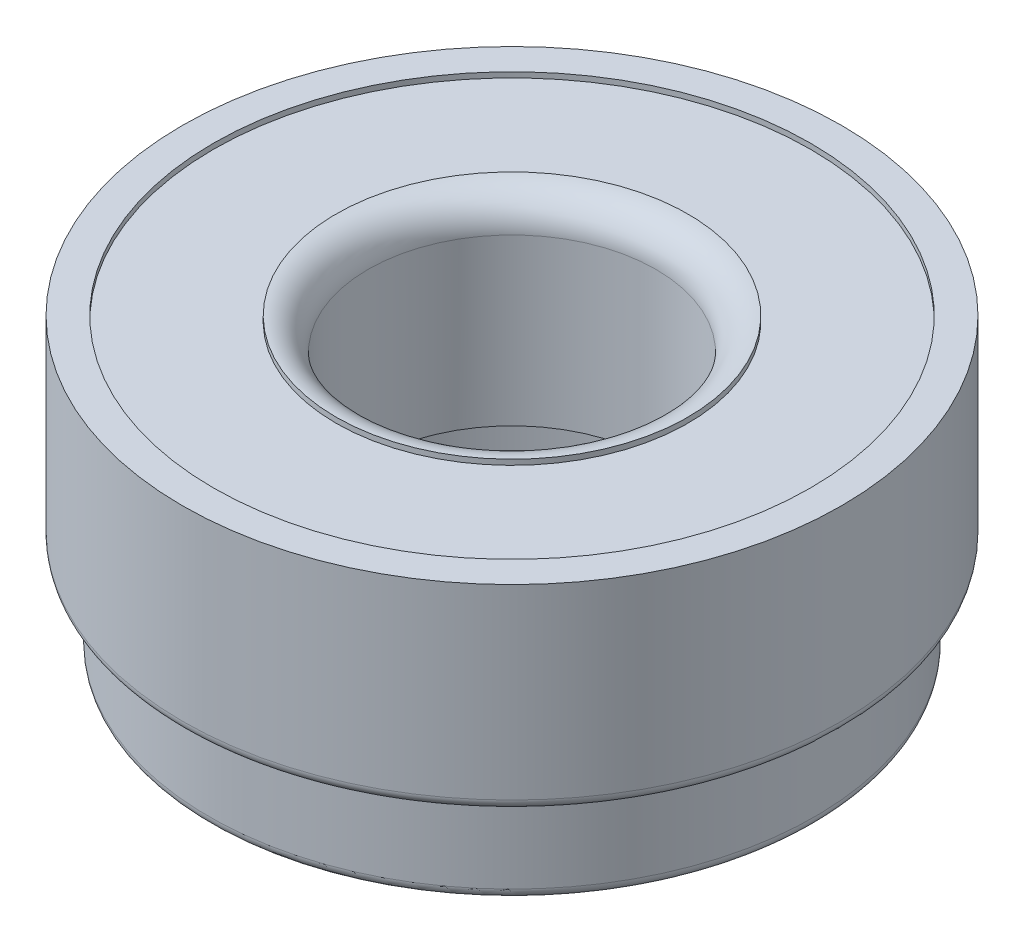
ISO-10303-21;
HEADER;
FILE_DESCRIPTION(('STEP AP214'),'2;1');
FILE_NAME('part.step','',(''),(''),'','','');
FILE_SCHEMA(('AUTOMOTIVE_DESIGN { 1 0 10303 214 1 1 1 1 }'));
ENDSEC;
DATA;
#1=APPLICATION_CONTEXT('core data for automotive mechanical design processes');
#2=APPLICATION_PROTOCOL_DEFINITION('international standard','automotive_design',2000,#1);
#3=PRODUCT_CONTEXT('',#1,'mechanical');
#4=PRODUCT('Part','Part','',(#3));
#5=PRODUCT_RELATED_PRODUCT_CATEGORY('part','',(#4));
#6=PRODUCT_DEFINITION_FORMATION('','',#4);
#7=PRODUCT_DEFINITION_CONTEXT('part definition',#1,'design');
#8=PRODUCT_DEFINITION('design','',#6,#7);
#9=PRODUCT_DEFINITION_SHAPE('','',#8);
#10=(LENGTH_UNIT() NAMED_UNIT(*) SI_UNIT(.MILLI.,.METRE.));
#11=(NAMED_UNIT(*) PLANE_ANGLE_UNIT() SI_UNIT($,.RADIAN.));
#12=(NAMED_UNIT(*) SI_UNIT($,.STERADIAN.) SOLID_ANGLE_UNIT());
#13=UNCERTAINTY_MEASURE_WITH_UNIT(LENGTH_MEASURE(1.E-05),#10,'distance_accuracy_value','');
#14=(GEOMETRIC_REPRESENTATION_CONTEXT(3) GLOBAL_UNCERTAINTY_ASSIGNED_CONTEXT((#13)) GLOBAL_UNIT_ASSIGNED_CONTEXT((#10,
#11,#12)) REPRESENTATION_CONTEXT('',''));
#15=CARTESIAN_POINT('',(0.,0.,0.));
#16=DIRECTION('',(0.,0.,1.));
#17=DIRECTION('',(1.,0.,0.));
#18=AXIS2_PLACEMENT_3D('',#15,#16,#17);
#19=CARTESIAN_POINT('',(0.,0.,0.));
#20=DIRECTION('',(0.,-1.,0.));
#21=DIRECTION('',(0.,0.,-1.));
#22=AXIS2_PLACEMENT_3D('',#19,#20,#21);
#23=CYLINDRICAL_SURFACE('',#22,28.4);
#24=CARTESIAN_POINT('',(0.,1.,0.));
#25=DIRECTION('',(0.,-1.,0.));
#26=DIRECTION('',(0.,0.,-1.));
#27=AXIS2_PLACEMENT_3D('',#24,#25,#26);
#28=CIRCLE('',#27,28.4);
#29=CARTESIAN_POINT('',(0.,1.,-28.4));
#30=VERTEX_POINT('',#29);
#31=EDGE_CURVE('E48',#30,#30,#28,.F.);
#32=ORIENTED_EDGE('',*,*,#31,.T.);
#33=EDGE_LOOP('',(#32));
#34=FACE_BOUND('',#33,.T.);
#35=CARTESIAN_POINT('',(0.,9.,0.));
#36=DIRECTION('',(0.,-1.,0.));
#37=DIRECTION('',(0.,0.,-1.));
#38=AXIS2_PLACEMENT_3D('',#35,#36,#37);
#39=CIRCLE('',#38,28.4);
#40=CARTESIAN_POINT('',(0.,9.,-28.4));
#41=VERTEX_POINT('',#40);
#42=EDGE_CURVE('E68',#41,#41,#39,.T.);
#43=ORIENTED_EDGE('',*,*,#42,.T.);
#44=EDGE_LOOP('',(#43));
#45=FACE_BOUND('',#44,.T.);
#46=ADVANCED_FACE('F33',(#34,#45),#23,.T.);
#47=CARTESIAN_POINT('',(23.4,0.,0.));
#48=DIRECTION('',(0.,-1.,0.));
#49=DIRECTION('',(0.,0.,-1.));
#50=AXIS2_PLACEMENT_3D('',#47,#48,#49);
#51=PLANE('',#50);
#52=CARTESIAN_POINT('',(0.,0.,0.));
#53=DIRECTION('',(0.,-1.,0.));
#54=DIRECTION('',(0.,0.,-1.));
#55=AXIS2_PLACEMENT_3D('',#52,#53,#54);
#56=CIRCLE('',#55,27.4);
#57=CARTESIAN_POINT('',(0.,0.,-27.4));
#58=VERTEX_POINT('',#57);
#59=EDGE_CURVE('E53',#58,#58,#56,.T.);
#60=ORIENTED_EDGE('',*,*,#59,.T.);
#61=EDGE_LOOP('',(#60));
#62=FACE_BOUND('',#61,.T.);
#63=CARTESIAN_POINT('',(0.,0.,0.));
#64=DIRECTION('',(0.,-1.,0.));
#65=DIRECTION('',(0.,0.,-1.));
#66=AXIS2_PLACEMENT_3D('',#63,#64,#65);
#67=CIRCLE('',#66,23.4);
#68=CARTESIAN_POINT('',(0.,0.,-23.4));
#69=VERTEX_POINT('',#68);
#70=EDGE_CURVE('E56',#69,#69,#67,.T.);
#71=ORIENTED_EDGE('',*,*,#70,.F.);
#72=EDGE_LOOP('',(#71));
#73=FACE_BOUND('',#72,.T.);
#74=ADVANCED_FACE('F118',(#62,#73),#51,.T.);
#75=CARTESIAN_POINT('',(0.,0.,0.));
#76=DIRECTION('',(0.,-1.,0.));
#77=DIRECTION('',(0.,0.,-1.));
#78=AXIS2_PLACEMENT_3D('',#75,#76,#77);
#79=CYLINDRICAL_SURFACE('',#78,23.4);
#80=ORIENTED_EDGE('',*,*,#70,.T.);
#81=EDGE_LOOP('',(#80));
#82=FACE_BOUND('',#81,.T.);
#83=CARTESIAN_POINT('',(0.,9.,0.));
#84=DIRECTION('',(0.,-1.,0.));
#85=DIRECTION('',(0.,0.,-1.));
#86=AXIS2_PLACEMENT_3D('',#83,#84,#85);
#87=CIRCLE('',#86,23.4);
#88=CARTESIAN_POINT('',(0.,9.,-23.4));
#89=VERTEX_POINT('',#88);
#90=EDGE_CURVE('E59',#89,#89,#87,.T.);
#91=ORIENTED_EDGE('',*,*,#90,.F.);
#92=EDGE_LOOP('',(#91));
#93=FACE_BOUND('',#92,.T.);
#94=ADVANCED_FACE('F124',(#82,#93),#79,.F.);
#95=CARTESIAN_POINT('',(13.5,9.,0.));
#96=DIRECTION('',(0.,-1.,0.));
#97=DIRECTION('',(0.,0.,-1.));
#98=AXIS2_PLACEMENT_3D('',#95,#96,#97);
#99=PLANE('',#98);
#100=ORIENTED_EDGE('',*,*,#90,.T.);
#101=EDGE_LOOP('',(#100));
#102=FACE_BOUND('',#101,.T.);
#103=CARTESIAN_POINT('',(0.,9.,0.));
#104=DIRECTION('',(0.,-1.,0.));
#105=DIRECTION('',(0.,0.,-1.));
#106=AXIS2_PLACEMENT_3D('',#103,#104,#105);
#107=CIRCLE('',#106,13.5);
#108=CARTESIAN_POINT('',(0.,9.,-13.5));
#109=VERTEX_POINT('',#108);
#110=EDGE_CURVE('E62',#109,#109,#107,.T.);
#111=ORIENTED_EDGE('',*,*,#110,.F.);
#112=EDGE_LOOP('',(#111));
#113=FACE_BOUND('',#112,.T.);
#114=ADVANCED_FACE('F171',(#102,#113),#99,.T.);
#115=CARTESIAN_POINT('',(0.,0.,0.));
#116=DIRECTION('',(0.,-1.,0.));
#117=DIRECTION('',(0.,0.,-1.));
#118=AXIS2_PLACEMENT_3D('',#115,#116,#117);
#119=CYLINDRICAL_SURFACE('',#118,13.5);
#120=CARTESIAN_POINT('',(0.,24.5,0.));
#121=DIRECTION('',(0.,1.,0.));
#122=DIRECTION('',(0.,0.,1.));
#123=AXIS2_PLACEMENT_3D('',#120,#121,#122);
#124=CIRCLE('',#123,13.5);
#125=CARTESIAN_POINT('',(0.,24.5,13.5));
#126=VERTEX_POINT('',#125);
#127=EDGE_CURVE('E10',#126,#126,#124,.T.);
#128=ORIENTED_EDGE('',*,*,#127,.T.);
#129=EDGE_LOOP('',(#128));
#130=FACE_BOUND('',#129,.T.);
#131=ORIENTED_EDGE('',*,*,#110,.T.);
#132=EDGE_LOOP('',(#131));
#133=FACE_BOUND('',#132,.T.);
#134=ADVANCED_FACE('F104',(#130,#133),#119,.F.);
#135=CARTESIAN_POINT('',(30.9,27.5,0.));
#136=DIRECTION('',(0.,1.,0.));
#137=DIRECTION('',(0.,0.,1.));
#138=AXIS2_PLACEMENT_3D('',#135,#136,#137);
#139=PLANE('',#138);
#140=CARTESIAN_POINT('',(0.,27.5,0.));
#141=DIRECTION('',(0.,1.,0.));
#142=DIRECTION('',(0.,0.,1.));
#143=AXIS2_PLACEMENT_3D('',#140,#141,#142);
#144=CIRCLE('',#143,28.);
#145=CARTESIAN_POINT('',(0.,27.5,28.));
#146=VERTEX_POINT('',#145);
#147=EDGE_CURVE('E72',#146,#146,#144,.T.);
#148=ORIENTED_EDGE('',*,*,#147,.F.);
#149=EDGE_LOOP('',(#148));
#150=FACE_BOUND('',#149,.T.);
#151=CARTESIAN_POINT('',(0.,27.5,0.));
#152=DIRECTION('',(0.,-1.,0.));
#153=DIRECTION('',(0.,0.,-1.));
#154=AXIS2_PLACEMENT_3D('',#151,#152,#153);
#155=CIRCLE('',#154,30.9);
#156=CARTESIAN_POINT('',(0.,27.5,-30.9));
#157=VERTEX_POINT('',#156);
#158=EDGE_CURVE('E65',#157,#157,#155,.T.);
#159=ORIENTED_EDGE('',*,*,#158,.F.);
#160=EDGE_LOOP('',(#159));
#161=FACE_BOUND('',#160,.T.);
#162=ADVANCED_FACE('F100',(#150,#161),#139,.T.);
#163=CARTESIAN_POINT('',(0.,0.,0.));
#164=DIRECTION('',(0.,-1.,0.));
#165=DIRECTION('',(0.,0.,-1.));
#166=AXIS2_PLACEMENT_3D('',#163,#164,#165);
#167=CYLINDRICAL_SURFACE('',#166,30.9);
#168=CARTESIAN_POINT('',(0.,10.,0.));
#169=DIRECTION('',(0.,-1.,0.));
#170=DIRECTION('',(0.,0.,-1.));
#171=AXIS2_PLACEMENT_3D('',#168,#169,#170);
#172=CIRCLE('',#171,30.9);
#173=CARTESIAN_POINT('',(0.,10.,-30.9));
#174=VERTEX_POINT('',#173);
#175=EDGE_CURVE('E40',#174,#174,#172,.F.);
#176=ORIENTED_EDGE('',*,*,#175,.T.);
#177=EDGE_LOOP('',(#176));
#178=FACE_BOUND('',#177,.T.);
#179=ORIENTED_EDGE('',*,*,#158,.T.);
#180=EDGE_LOOP('',(#179));
#181=FACE_BOUND('',#180,.T.);
#182=ADVANCED_FACE('F103',(#178,#181),#167,.T.);
#183=CARTESIAN_POINT('',(28.4,9.,0.));
#184=DIRECTION('',(0.,-1.,0.));
#185=DIRECTION('',(0.,0.,-1.));
#186=AXIS2_PLACEMENT_3D('',#183,#184,#185);
#187=PLANE('',#186);
#188=CARTESIAN_POINT('',(0.,9.,0.));
#189=DIRECTION('',(0.,-1.,0.));
#190=DIRECTION('',(0.,0.,-1.));
#191=AXIS2_PLACEMENT_3D('',#188,#189,#190);
#192=CIRCLE('',#191,29.9);
#193=CARTESIAN_POINT('',(0.,9.,-29.9));
#194=VERTEX_POINT('',#193);
#195=EDGE_CURVE('E44',#194,#194,#192,.T.);
#196=ORIENTED_EDGE('',*,*,#195,.T.);
#197=EDGE_LOOP('',(#196));
#198=FACE_BOUND('',#197,.T.);
#199=ORIENTED_EDGE('',*,*,#42,.F.);
#200=EDGE_LOOP('',(#199));
#201=FACE_BOUND('',#200,.T.);
#202=ADVANCED_FACE('F109',(#198,#201),#187,.T.);
#203=CARTESIAN_POINT('',(0.,1.,0.));
#204=DIRECTION('',(0.,-1.,0.));
#205=DIRECTION('',(0.,0.,-1.));
#206=AXIS2_PLACEMENT_3D('',#203,#204,#205);
#207=TOROIDAL_SURFACE('',#206,27.4,1.);
#208=ORIENTED_EDGE('',*,*,#31,.F.);
#209=EDGE_LOOP('',(#208));
#210=FACE_BOUND('',#209,.T.);
#211=ORIENTED_EDGE('',*,*,#59,.F.);
#212=EDGE_LOOP('',(#211));
#213=FACE_BOUND('',#212,.T.);
#214=ADVANCED_FACE('F114',(#210,#213),#207,.T.);
#215=CARTESIAN_POINT('',(0.,10.,0.));
#216=DIRECTION('',(0.,-1.,0.));
#217=DIRECTION('',(0.,0.,-1.));
#218=AXIS2_PLACEMENT_3D('',#215,#216,#217);
#219=TOROIDAL_SURFACE('',#218,29.9,1.);
#220=ORIENTED_EDGE('',*,*,#175,.F.);
#221=EDGE_LOOP('',(#220));
#222=FACE_BOUND('',#221,.T.);
#223=ORIENTED_EDGE('',*,*,#195,.F.);
#224=EDGE_LOOP('',(#223));
#225=FACE_BOUND('',#224,.T.);
#226=ADVANCED_FACE('F96',(#222,#225),#219,.T.);
#227=CARTESIAN_POINT('',(0.,27.,0.));
#228=DIRECTION('',(0.,1.,0.));
#229=DIRECTION('',(0.,0.,1.));
#230=AXIS2_PLACEMENT_3D('',#227,#228,#229);
#231=CYLINDRICAL_SURFACE('',#230,28.);
#232=CARTESIAN_POINT('',(0.,27.,0.));
#233=DIRECTION('',(0.,1.,0.));
#234=DIRECTION('',(0.,0.,1.));
#235=AXIS2_PLACEMENT_3D('',#232,#233,#234);
#236=CIRCLE('',#235,28.);
#237=CARTESIAN_POINT('',(0.,27.,28.));
#238=VERTEX_POINT('',#237);
#239=EDGE_CURVE('E71',#238,#238,#236,.T.);
#240=ORIENTED_EDGE('',*,*,#239,.F.);
#241=EDGE_LOOP('',(#240));
#242=FACE_BOUND('',#241,.T.);
#243=ORIENTED_EDGE('',*,*,#147,.T.);
#244=EDGE_LOOP('',(#243));
#245=FACE_BOUND('',#244,.T.);
#246=ADVANCED_FACE('F90',(#242,#245),#231,.F.);
#247=CARTESIAN_POINT('',(0.,27.,0.));
#248=DIRECTION('',(0.,1.,0.));
#249=DIRECTION('',(0.,0.,1.));
#250=AXIS2_PLACEMENT_3D('',#247,#248,#249);
#251=PLANE('',#250);
#252=CARTESIAN_POINT('',(0.,27.,0.));
#253=DIRECTION('',(0.,1.,0.));
#254=DIRECTION('',(0.,0.,1.));
#255=AXIS2_PLACEMENT_3D('',#252,#253,#254);
#256=CIRCLE('',#255,16.5);
#257=CARTESIAN_POINT('',(0.,27.,16.5));
#258=VERTEX_POINT('',#257);
#259=EDGE_CURVE('E75',#258,#258,#256,.T.);
#260=ORIENTED_EDGE('',*,*,#259,.F.);
#261=EDGE_LOOP('',(#260));
#262=FACE_BOUND('',#261,.T.);
#263=ORIENTED_EDGE('',*,*,#239,.T.);
#264=EDGE_LOOP('',(#263));
#265=FACE_BOUND('',#264,.T.);
#266=ADVANCED_FACE('F87',(#262,#265),#251,.T.);
#267=CARTESIAN_POINT('',(0.,27.,0.));
#268=DIRECTION('',(0.,1.,0.));
#269=DIRECTION('',(0.,0.,1.));
#270=AXIS2_PLACEMENT_3D('',#267,#268,#269);
#271=CYLINDRICAL_SURFACE('',#270,16.5);
#272=ORIENTED_EDGE('',*,*,#259,.T.);
#273=EDGE_LOOP('',(#272));
#274=FACE_BOUND('',#273,.T.);
#275=CARTESIAN_POINT('',(0.,27.5,0.));
#276=DIRECTION('',(0.,1.,0.));
#277=DIRECTION('',(0.,0.,1.));
#278=AXIS2_PLACEMENT_3D('',#275,#276,#277);
#279=CIRCLE('',#278,16.5);
#280=CARTESIAN_POINT('',(0.,27.5,16.5));
#281=VERTEX_POINT('',#280);
#282=EDGE_CURVE('E78',#281,#281,#279,.T.);
#283=ORIENTED_EDGE('',*,*,#282,.F.);
#284=EDGE_LOOP('',(#283));
#285=FACE_BOUND('',#284,.T.);
#286=ADVANCED_FACE('F84',(#274,#285),#271,.T.);
#287=CARTESIAN_POINT('',(0.,24.5,0.));
#288=DIRECTION('',(0.,1.,0.));
#289=DIRECTION('',(0.,0.,1.));
#290=AXIS2_PLACEMENT_3D('',#287,#288,#289);
#291=TOROIDAL_SURFACE('',#290,16.5,3.);
#292=ORIENTED_EDGE('',*,*,#127,.F.);
#293=EDGE_LOOP('',(#292));
#294=FACE_BOUND('',#293,.T.);
#295=ORIENTED_EDGE('',*,*,#282,.T.);
#296=EDGE_LOOP('',(#295));
#297=FACE_BOUND('',#296,.T.);
#298=ADVANCED_FACE('F35',(#294,#297),#291,.T.);
#299=CLOSED_SHELL('',(#46,#74,#94,#114,#134,#162,#182,#202,#214,#226,#246,#266,#286,#298));
#300=MANIFOLD_SOLID_BREP('B2',#299);
#301=ADVANCED_BREP_SHAPE_REPRESENTATION('',(#18,#300),#14);
#302=SHAPE_DEFINITION_REPRESENTATION(#9,#301);
ENDSEC;
END-ISO-10303-21;
